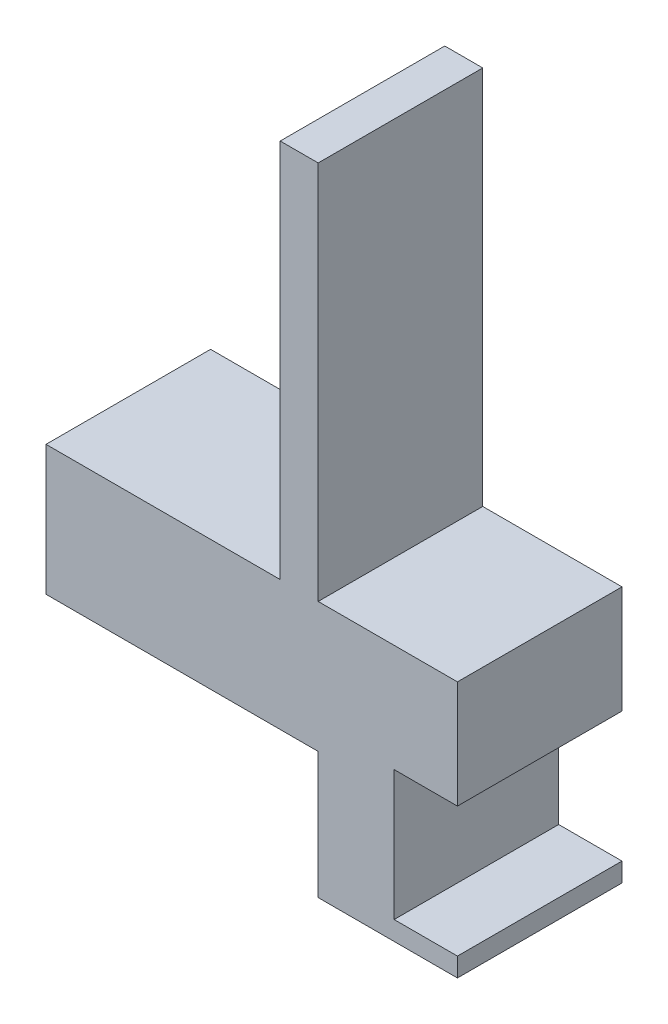
ISO-10303-21;
HEADER;
FILE_DESCRIPTION(('STEP AP214'),'2;1');
FILE_NAME('part.step','',(''),(''),'','','');
FILE_SCHEMA(('AUTOMOTIVE_DESIGN { 1 0 10303 214 1 1 1 1 }'));
ENDSEC;
DATA;
#1=APPLICATION_CONTEXT('core data for automotive mechanical design processes');
#2=APPLICATION_PROTOCOL_DEFINITION('international standard','automotive_design',2000,#1);
#3=PRODUCT_CONTEXT('',#1,'mechanical');
#4=PRODUCT('Part','Part','',(#3));
#5=PRODUCT_RELATED_PRODUCT_CATEGORY('part','',(#4));
#6=PRODUCT_DEFINITION_FORMATION('','',#4);
#7=PRODUCT_DEFINITION_CONTEXT('part definition',#1,'design');
#8=PRODUCT_DEFINITION('design','',#6,#7);
#9=PRODUCT_DEFINITION_SHAPE('','',#8);
#10=(LENGTH_UNIT() NAMED_UNIT(*) SI_UNIT(.MILLI.,.METRE.));
#11=(NAMED_UNIT(*) PLANE_ANGLE_UNIT() SI_UNIT($,.RADIAN.));
#12=(NAMED_UNIT(*) SI_UNIT($,.STERADIAN.) SOLID_ANGLE_UNIT());
#13=UNCERTAINTY_MEASURE_WITH_UNIT(LENGTH_MEASURE(1.E-05),#10,'distance_accuracy_value','');
#14=(GEOMETRIC_REPRESENTATION_CONTEXT(3) GLOBAL_UNCERTAINTY_ASSIGNED_CONTEXT((#13)) GLOBAL_UNIT_ASSIGNED_CONTEXT((#10,
#11,#12)) REPRESENTATION_CONTEXT('',''));
#15=CARTESIAN_POINT('',(0.,0.,0.));
#16=DIRECTION('',(0.,0.,1.));
#17=DIRECTION('',(1.,0.,0.));
#18=AXIS2_PLACEMENT_3D('',#15,#16,#17);
#19=CARTESIAN_POINT('',(0.,20.52,26.));
#20=DIRECTION('',(0.,-1.,0.));
#21=DIRECTION('',(0.,0.,-1.));
#22=AXIS2_PLACEMENT_3D('',#19,#20,#21);
#23=PLANE('',#22);
#24=DIRECTION('',(0.,0.,1.));
#25=VECTOR('',#24,1.);
#26=CARTESIAN_POINT('',(37.,20.52,0.));
#27=LINE('',#26,#25);
#28=CARTESIAN_POINT('',(37.,20.52,0.));
#29=VERTEX_POINT('',#28);
#30=CARTESIAN_POINT('',(37.,20.52,26.));
#31=VERTEX_POINT('',#30);
#32=EDGE_CURVE('E193',#29,#31,#27,.T.);
#33=ORIENTED_EDGE('',*,*,#32,.F.);
#34=DIRECTION('',(-1.,0.,0.));
#35=VECTOR('',#34,1.);
#36=CARTESIAN_POINT('',(0.,20.52,0.));
#37=LINE('',#36,#35);
#38=CARTESIAN_POINT('',(0.,20.52,0.));
#39=VERTEX_POINT('',#38);
#40=EDGE_CURVE('E266',#29,#39,#37,.T.);
#41=ORIENTED_EDGE('',*,*,#40,.T.);
#42=DIRECTION('',(0.,0.,-1.));
#43=VECTOR('',#42,1.);
#44=CARTESIAN_POINT('',(0.,20.52,26.));
#45=LINE('',#44,#43);
#46=CARTESIAN_POINT('',(0.,20.52,26.));
#47=VERTEX_POINT('',#46);
#48=EDGE_CURVE('E246',#47,#39,#45,.T.);
#49=ORIENTED_EDGE('',*,*,#48,.F.);
#50=DIRECTION('',(-1.,0.,0.));
#51=VECTOR('',#50,1.);
#52=CARTESIAN_POINT('',(45.,20.52,26.));
#53=LINE('',#52,#51);
#54=EDGE_CURVE('E56',#31,#47,#53,.T.);
#55=ORIENTED_EDGE('',*,*,#54,.F.);
#56=EDGE_LOOP('',(#33,#41,#49,#55));
#57=FACE_BOUND('',#56,.T.);
#58=ADVANCED_FACE('F33',(#57),#23,.F.);
#59=DIRECTION('',(0.,0.,-1.));
#60=VECTOR('',#59,1.);
#61=CARTESIAN_POINT('',(43.,20.52,0.));
#62=LINE('',#61,#60);
#63=CARTESIAN_POINT('',(43.,20.52,26.));
#64=VERTEX_POINT('',#63);
#65=CARTESIAN_POINT('',(43.,20.52,0.));
#66=VERTEX_POINT('',#65);
#67=EDGE_CURVE('E201',#64,#66,#62,.T.);
#68=ORIENTED_EDGE('',*,*,#67,.F.);
#69=CARTESIAN_POINT('',(65.,20.52,26.));
#70=VERTEX_POINT('',#69);
#71=EDGE_CURVE('E243',#70,#64,#53,.T.);
#72=ORIENTED_EDGE('',*,*,#71,.F.);
#73=DIRECTION('',(0.,0.,-1.));
#74=VECTOR('',#73,1.);
#75=CARTESIAN_POINT('',(65.,20.52,26.));
#76=LINE('',#75,#74);
#77=CARTESIAN_POINT('',(65.,20.52,0.));
#78=VERTEX_POINT('',#77);
#79=EDGE_CURVE('E270',#70,#78,#76,.T.);
#80=ORIENTED_EDGE('',*,*,#79,.T.);
#81=EDGE_CURVE('E227',#78,#66,#37,.T.);
#82=ORIENTED_EDGE('',*,*,#81,.T.);
#83=EDGE_LOOP('',(#68,#72,#80,#82));
#84=FACE_BOUND('',#83,.T.);
#85=ADVANCED_FACE('F337',(#84),#23,.F.);
#86=CARTESIAN_POINT('',(0.,0.,26.));
#87=DIRECTION('',(1.,0.,0.));
#88=DIRECTION('',(0.,0.,-1.));
#89=AXIS2_PLACEMENT_3D('',#86,#87,#88);
#90=PLANE('',#89);
#91=DIRECTION('',(0.,-1.,0.));
#92=VECTOR('',#91,1.);
#93=CARTESIAN_POINT('',(0.,0.,0.));
#94=LINE('',#93,#92);
#95=CARTESIAN_POINT('',(0.,0.,0.));
#96=VERTEX_POINT('',#95);
#97=EDGE_CURVE('E222',#39,#96,#94,.T.);
#98=ORIENTED_EDGE('',*,*,#97,.T.);
#99=DIRECTION('',(0.,0.,-1.));
#100=VECTOR('',#99,1.);
#101=CARTESIAN_POINT('',(0.,0.,26.));
#102=LINE('',#101,#100);
#103=CARTESIAN_POINT('',(0.,0.,26.));
#104=VERTEX_POINT('',#103);
#105=EDGE_CURVE('E11',#104,#96,#102,.T.);
#106=ORIENTED_EDGE('',*,*,#105,.F.);
#107=DIRECTION('',(0.,-1.,0.));
#108=VECTOR('',#107,1.);
#109=CARTESIAN_POINT('',(0.,0.,26.));
#110=LINE('',#109,#108);
#111=EDGE_CURVE('E223',#47,#104,#110,.T.);
#112=ORIENTED_EDGE('',*,*,#111,.F.);
#113=ORIENTED_EDGE('',*,*,#48,.T.);
#114=EDGE_LOOP('',(#98,#106,#112,#113));
#115=FACE_BOUND('',#114,.T.);
#116=ADVANCED_FACE('F35',(#115),#90,.F.);
#117=CARTESIAN_POINT('',(0.,0.,26.));
#118=DIRECTION('',(0.,1.,0.));
#119=DIRECTION('',(0.,0.,1.));
#120=AXIS2_PLACEMENT_3D('',#117,#118,#119);
#121=PLANE('',#120);
#122=DIRECTION('',(1.,0.,0.));
#123=VECTOR('',#122,1.);
#124=CARTESIAN_POINT('',(0.,0.,0.));
#125=LINE('',#124,#123);
#126=CARTESIAN_POINT('',(43.,0.,0.));
#127=VERTEX_POINT('',#126);
#128=EDGE_CURVE('E249',#96,#127,#125,.T.);
#129=ORIENTED_EDGE('',*,*,#128,.T.);
#130=DIRECTION('',(0.,0.,-1.));
#131=VECTOR('',#130,1.);
#132=CARTESIAN_POINT('',(43.,0.,26.));
#133=LINE('',#132,#131);
#134=CARTESIAN_POINT('',(43.,0.,26.));
#135=VERTEX_POINT('',#134);
#136=EDGE_CURVE('E41',#135,#127,#133,.T.);
#137=ORIENTED_EDGE('',*,*,#136,.F.);
#138=DIRECTION('',(1.,0.,0.));
#139=VECTOR('',#138,1.);
#140=CARTESIAN_POINT('',(0.,0.,26.));
#141=LINE('',#140,#139);
#142=EDGE_CURVE('E226',#104,#135,#141,.T.);
#143=ORIENTED_EDGE('',*,*,#142,.F.);
#144=ORIENTED_EDGE('',*,*,#105,.T.);
#145=EDGE_LOOP('',(#129,#137,#143,#144));
#146=FACE_BOUND('',#145,.T.);
#147=ADVANCED_FACE('F318',(#146),#121,.F.);
#148=CARTESIAN_POINT('',(43.,-20.,26.));
#149=DIRECTION('',(1.,0.,0.));
#150=DIRECTION('',(0.,0.,-1.));
#151=AXIS2_PLACEMENT_3D('',#148,#149,#150);
#152=PLANE('',#151);
#153=DIRECTION('',(0.,-1.,0.));
#154=VECTOR('',#153,1.);
#155=CARTESIAN_POINT('',(43.,-20.,0.));
#156=LINE('',#155,#154);
#157=CARTESIAN_POINT('',(43.,-20.,0.));
#158=VERTEX_POINT('',#157);
#159=EDGE_CURVE('E251',#127,#158,#156,.T.);
#160=ORIENTED_EDGE('',*,*,#159,.T.);
#161=DIRECTION('',(0.,0.,-1.));
#162=VECTOR('',#161,1.);
#163=CARTESIAN_POINT('',(43.,-20.,26.));
#164=LINE('',#163,#162);
#165=CARTESIAN_POINT('',(43.,-20.,26.));
#166=VERTEX_POINT('',#165);
#167=EDGE_CURVE('E288',#166,#158,#164,.T.);
#168=ORIENTED_EDGE('',*,*,#167,.F.);
#169=DIRECTION('',(0.,-1.,0.));
#170=VECTOR('',#169,1.);
#171=CARTESIAN_POINT('',(43.,-20.,26.));
#172=LINE('',#171,#170);
#173=EDGE_CURVE('E229',#135,#166,#172,.T.);
#174=ORIENTED_EDGE('',*,*,#173,.F.);
#175=ORIENTED_EDGE('',*,*,#136,.T.);
#176=EDGE_LOOP('',(#160,#168,#174,#175));
#177=FACE_BOUND('',#176,.T.);
#178=ADVANCED_FACE('F295',(#177),#152,.F.);
#179=CARTESIAN_POINT('',(65.,-20.,26.));
#180=DIRECTION('',(0.,1.,0.));
#181=DIRECTION('',(0.,0.,1.));
#182=AXIS2_PLACEMENT_3D('',#179,#180,#181);
#183=PLANE('',#182);
#184=DIRECTION('',(1.,0.,0.));
#185=VECTOR('',#184,1.);
#186=CARTESIAN_POINT('',(65.,-20.,0.));
#187=LINE('',#186,#185);
#188=CARTESIAN_POINT('',(65.,-20.,0.));
#189=VERTEX_POINT('',#188);
#190=EDGE_CURVE('E253',#158,#189,#187,.T.);
#191=ORIENTED_EDGE('',*,*,#190,.T.);
#192=DIRECTION('',(0.,0.,-1.));
#193=VECTOR('',#192,1.);
#194=CARTESIAN_POINT('',(65.,-20.,26.));
#195=LINE('',#194,#193);
#196=CARTESIAN_POINT('',(65.,-20.,26.));
#197=VERTEX_POINT('',#196);
#198=EDGE_CURVE('E285',#197,#189,#195,.T.);
#199=ORIENTED_EDGE('',*,*,#198,.F.);
#200=DIRECTION('',(1.,0.,0.));
#201=VECTOR('',#200,1.);
#202=CARTESIAN_POINT('',(65.,-20.,26.));
#203=LINE('',#202,#201);
#204=EDGE_CURVE('E231',#166,#197,#203,.T.);
#205=ORIENTED_EDGE('',*,*,#204,.F.);
#206=ORIENTED_EDGE('',*,*,#167,.T.);
#207=EDGE_LOOP('',(#191,#199,#205,#206));
#208=FACE_BOUND('',#207,.T.);
#209=ADVANCED_FACE('F306',(#208),#183,.F.);
#210=CARTESIAN_POINT('',(65.,-17.,26.));
#211=DIRECTION('',(-1.,0.,0.));
#212=DIRECTION('',(0.,0.,1.));
#213=AXIS2_PLACEMENT_3D('',#210,#211,#212);
#214=PLANE('',#213);
#215=DIRECTION('',(0.,1.,0.));
#216=VECTOR('',#215,1.);
#217=CARTESIAN_POINT('',(65.,-17.,0.));
#218=LINE('',#217,#216);
#219=CARTESIAN_POINT('',(65.,-17.,0.));
#220=VERTEX_POINT('',#219);
#221=EDGE_CURVE('E255',#189,#220,#218,.T.);
#222=ORIENTED_EDGE('',*,*,#221,.T.);
#223=DIRECTION('',(0.,0.,-1.));
#224=VECTOR('',#223,1.);
#225=CARTESIAN_POINT('',(65.,-17.,26.));
#226=LINE('',#225,#224);
#227=CARTESIAN_POINT('',(65.,-17.,26.));
#228=VERTEX_POINT('',#227);
#229=EDGE_CURVE('E282',#228,#220,#226,.T.);
#230=ORIENTED_EDGE('',*,*,#229,.F.);
#231=DIRECTION('',(0.,1.,0.));
#232=VECTOR('',#231,1.);
#233=CARTESIAN_POINT('',(65.,-17.,26.));
#234=LINE('',#233,#232);
#235=EDGE_CURVE('E233',#197,#228,#234,.T.);
#236=ORIENTED_EDGE('',*,*,#235,.F.);
#237=ORIENTED_EDGE('',*,*,#198,.T.);
#238=EDGE_LOOP('',(#222,#230,#236,#237));
#239=FACE_BOUND('',#238,.T.);
#240=ADVANCED_FACE('F310',(#239),#214,.F.);
#241=CARTESIAN_POINT('',(55.,-17.,26.));
#242=DIRECTION('',(0.,-1.,0.));
#243=DIRECTION('',(0.,0.,-1.));
#244=AXIS2_PLACEMENT_3D('',#241,#242,#243);
#245=PLANE('',#244);
#246=DIRECTION('',(-1.,0.,0.));
#247=VECTOR('',#246,1.);
#248=CARTESIAN_POINT('',(55.,-17.,0.));
#249=LINE('',#248,#247);
#250=CARTESIAN_POINT('',(55.,-17.,0.));
#251=VERTEX_POINT('',#250);
#252=EDGE_CURVE('E257',#220,#251,#249,.T.);
#253=ORIENTED_EDGE('',*,*,#252,.T.);
#254=DIRECTION('',(0.,0.,-1.));
#255=VECTOR('',#254,1.);
#256=CARTESIAN_POINT('',(55.,-17.,26.));
#257=LINE('',#256,#255);
#258=CARTESIAN_POINT('',(55.,-17.,26.));
#259=VERTEX_POINT('',#258);
#260=EDGE_CURVE('E279',#259,#251,#257,.T.);
#261=ORIENTED_EDGE('',*,*,#260,.F.);
#262=DIRECTION('',(-1.,0.,0.));
#263=VECTOR('',#262,1.);
#264=CARTESIAN_POINT('',(55.,-17.,26.));
#265=LINE('',#264,#263);
#266=EDGE_CURVE('E235',#228,#259,#265,.T.);
#267=ORIENTED_EDGE('',*,*,#266,.F.);
#268=ORIENTED_EDGE('',*,*,#229,.T.);
#269=EDGE_LOOP('',(#253,#261,#267,#268));
#270=FACE_BOUND('',#269,.T.);
#271=ADVANCED_FACE('F353',(#270),#245,.F.);
#272=CARTESIAN_POINT('',(55.,3.52,26.));
#273=DIRECTION('',(-1.,0.,0.));
#274=DIRECTION('',(0.,0.,1.));
#275=AXIS2_PLACEMENT_3D('',#272,#273,#274);
#276=PLANE('',#275);
#277=DIRECTION('',(0.,1.,0.));
#278=VECTOR('',#277,1.);
#279=CARTESIAN_POINT('',(55.,3.52,0.));
#280=LINE('',#279,#278);
#281=CARTESIAN_POINT('',(55.,3.52,0.));
#282=VERTEX_POINT('',#281);
#283=EDGE_CURVE('E259',#251,#282,#280,.T.);
#284=ORIENTED_EDGE('',*,*,#283,.T.);
#285=DIRECTION('',(0.,0.,-1.));
#286=VECTOR('',#285,1.);
#287=CARTESIAN_POINT('',(55.,3.52,26.));
#288=LINE('',#287,#286);
#289=CARTESIAN_POINT('',(55.,3.52,26.));
#290=VERTEX_POINT('',#289);
#291=EDGE_CURVE('E276',#290,#282,#288,.T.);
#292=ORIENTED_EDGE('',*,*,#291,.F.);
#293=DIRECTION('',(0.,1.,0.));
#294=VECTOR('',#293,1.);
#295=CARTESIAN_POINT('',(55.,3.52,26.));
#296=LINE('',#295,#294);
#297=EDGE_CURVE('E237',#259,#290,#296,.T.);
#298=ORIENTED_EDGE('',*,*,#297,.F.);
#299=ORIENTED_EDGE('',*,*,#260,.T.);
#300=EDGE_LOOP('',(#284,#292,#298,#299));
#301=FACE_BOUND('',#300,.T.);
#302=ADVANCED_FACE('F351',(#301),#276,.F.);
#303=CARTESIAN_POINT('',(65.,3.52,26.));
#304=DIRECTION('',(0.,1.,0.));
#305=DIRECTION('',(-1.,0.,0.));
#306=AXIS2_PLACEMENT_3D('',#303,#304,#305);
#307=PLANE('',#306);
#308=DIRECTION('',(1.,0.,0.));
#309=VECTOR('',#308,1.);
#310=CARTESIAN_POINT('',(65.,3.52,0.));
#311=LINE('',#310,#309);
#312=CARTESIAN_POINT('',(65.,3.52,0.));
#313=VERTEX_POINT('',#312);
#314=EDGE_CURVE('E261',#282,#313,#311,.T.);
#315=ORIENTED_EDGE('',*,*,#314,.T.);
#316=DIRECTION('',(0.,0.,-1.));
#317=VECTOR('',#316,1.);
#318=CARTESIAN_POINT('',(65.,3.52,26.));
#319=LINE('',#318,#317);
#320=CARTESIAN_POINT('',(65.,3.52,26.));
#321=VERTEX_POINT('',#320);
#322=EDGE_CURVE('E273',#321,#313,#319,.T.);
#323=ORIENTED_EDGE('',*,*,#322,.F.);
#324=DIRECTION('',(1.,0.,0.));
#325=VECTOR('',#324,1.);
#326=CARTESIAN_POINT('',(65.,3.52,26.));
#327=LINE('',#326,#325);
#328=EDGE_CURVE('E239',#290,#321,#327,.T.);
#329=ORIENTED_EDGE('',*,*,#328,.F.);
#330=ORIENTED_EDGE('',*,*,#291,.T.);
#331=EDGE_LOOP('',(#315,#323,#329,#330));
#332=FACE_BOUND('',#331,.T.);
#333=ADVANCED_FACE('F347',(#332),#307,.F.);
#334=CARTESIAN_POINT('',(65.,20.52,26.));
#335=DIRECTION('',(-1.,0.,0.));
#336=DIRECTION('',(0.,0.,1.));
#337=AXIS2_PLACEMENT_3D('',#334,#335,#336);
#338=PLANE('',#337);
#339=DIRECTION('',(0.,1.,0.));
#340=VECTOR('',#339,1.);
#341=CARTESIAN_POINT('',(65.,20.52,0.));
#342=LINE('',#341,#340);
#343=EDGE_CURVE('E263',#313,#78,#342,.T.);
#344=ORIENTED_EDGE('',*,*,#343,.T.);
#345=ORIENTED_EDGE('',*,*,#79,.F.);
#346=DIRECTION('',(0.,1.,0.));
#347=VECTOR('',#346,1.);
#348=CARTESIAN_POINT('',(65.,20.52,26.));
#349=LINE('',#348,#347);
#350=EDGE_CURVE('E241',#321,#70,#349,.T.);
#351=ORIENTED_EDGE('',*,*,#350,.F.);
#352=ORIENTED_EDGE('',*,*,#322,.T.);
#353=EDGE_LOOP('',(#344,#345,#351,#352));
#354=FACE_BOUND('',#353,.T.);
#355=ADVANCED_FACE('F343',(#354),#338,.F.);
#356=CARTESIAN_POINT('',(0.,0.,26.));
#357=DIRECTION('',(0.,0.,-1.));
#358=DIRECTION('',(-1.,0.,0.));
#359=AXIS2_PLACEMENT_3D('',#356,#357,#358);
#360=PLANE('',#359);
#361=ORIENTED_EDGE('',*,*,#111,.T.);
#362=ORIENTED_EDGE('',*,*,#142,.T.);
#363=ORIENTED_EDGE('',*,*,#173,.T.);
#364=ORIENTED_EDGE('',*,*,#204,.T.);
#365=ORIENTED_EDGE('',*,*,#235,.T.);
#366=ORIENTED_EDGE('',*,*,#266,.T.);
#367=ORIENTED_EDGE('',*,*,#297,.T.);
#368=ORIENTED_EDGE('',*,*,#328,.T.);
#369=ORIENTED_EDGE('',*,*,#350,.T.);
#370=ORIENTED_EDGE('',*,*,#71,.T.);
#371=DIRECTION('',(0.,-1.,0.));
#372=VECTOR('',#371,1.);
#373=CARTESIAN_POINT('',(43.,80.52,26.));
#374=LINE('',#373,#372);
#375=CARTESIAN_POINT('',(43.,80.52,26.));
#376=VERTEX_POINT('',#375);
#377=EDGE_CURVE('E217',#376,#64,#374,.T.);
#378=ORIENTED_EDGE('',*,*,#377,.F.);
#379=DIRECTION('',(1.,0.,0.));
#380=VECTOR('',#379,1.);
#381=CARTESIAN_POINT('',(37.,80.52,26.));
#382=LINE('',#381,#380);
#383=CARTESIAN_POINT('',(37.,80.52,26.));
#384=VERTEX_POINT('',#383);
#385=EDGE_CURVE('E200',#384,#376,#382,.T.);
#386=ORIENTED_EDGE('',*,*,#385,.F.);
#387=DIRECTION('',(0.,-1.,0.));
#388=VECTOR('',#387,1.);
#389=CARTESIAN_POINT('',(37.,80.52,26.));
#390=LINE('',#389,#388);
#391=EDGE_CURVE('E220',#384,#31,#390,.T.);
#392=ORIENTED_EDGE('',*,*,#391,.T.);
#393=ORIENTED_EDGE('',*,*,#54,.T.);
#394=EDGE_LOOP('',(#361,#362,#363,#364,#365,#366,#367,#368,#369,#370,#378,#386,#392,#393));
#395=FACE_BOUND('',#394,.T.);
#396=ADVANCED_FACE('F314',(#395),#360,.F.);
#397=CARTESIAN_POINT('',(0.,0.,0.));
#398=DIRECTION('',(0.,0.,-1.));
#399=DIRECTION('',(-1.,0.,0.));
#400=AXIS2_PLACEMENT_3D('',#397,#398,#399);
#401=PLANE('',#400);
#402=ORIENTED_EDGE('',*,*,#97,.F.);
#403=ORIENTED_EDGE('',*,*,#40,.F.);
#404=DIRECTION('',(0.,-1.,0.));
#405=VECTOR('',#404,1.);
#406=CARTESIAN_POINT('',(37.,80.52,0.));
#407=LINE('',#406,#405);
#408=CARTESIAN_POINT('',(37.,80.52,0.));
#409=VERTEX_POINT('',#408);
#410=EDGE_CURVE('E207',#409,#29,#407,.T.);
#411=ORIENTED_EDGE('',*,*,#410,.F.);
#412=DIRECTION('',(-1.,0.,0.));
#413=VECTOR('',#412,1.);
#414=CARTESIAN_POINT('',(37.,80.52,0.));
#415=LINE('',#414,#413);
#416=CARTESIAN_POINT('',(43.,80.52,0.));
#417=VERTEX_POINT('',#416);
#418=EDGE_CURVE('E205',#417,#409,#415,.T.);
#419=ORIENTED_EDGE('',*,*,#418,.F.);
#420=DIRECTION('',(0.,-1.,0.));
#421=VECTOR('',#420,1.);
#422=CARTESIAN_POINT('',(43.,80.52,0.));
#423=LINE('',#422,#421);
#424=EDGE_CURVE('E214',#417,#66,#423,.T.);
#425=ORIENTED_EDGE('',*,*,#424,.T.);
#426=ORIENTED_EDGE('',*,*,#81,.F.);
#427=ORIENTED_EDGE('',*,*,#343,.F.);
#428=ORIENTED_EDGE('',*,*,#314,.F.);
#429=ORIENTED_EDGE('',*,*,#283,.F.);
#430=ORIENTED_EDGE('',*,*,#252,.F.);
#431=ORIENTED_EDGE('',*,*,#221,.F.);
#432=ORIENTED_EDGE('',*,*,#190,.F.);
#433=ORIENTED_EDGE('',*,*,#159,.F.);
#434=ORIENTED_EDGE('',*,*,#128,.F.);
#435=EDGE_LOOP('',(#402,#403,#411,#419,#425,#426,#427,#428,#429,#430,#431,#432,#433,#434));
#436=FACE_BOUND('',#435,.T.);
#437=ADVANCED_FACE('F301',(#436),#401,.T.);
#438=CARTESIAN_POINT('',(37.,80.52,0.));
#439=DIRECTION('',(1.,0.,0.));
#440=DIRECTION('',(0.,0.,-1.));
#441=AXIS2_PLACEMENT_3D('',#438,#439,#440);
#442=PLANE('',#441);
#443=DIRECTION('',(0.,0.,1.));
#444=VECTOR('',#443,1.);
#445=CARTESIAN_POINT('',(37.,65.27,5.1));
#446=LINE('',#445,#444);
#447=CARTESIAN_POINT('',(37.,65.27,5.1));
#448=VERTEX_POINT('',#447);
#449=CARTESIAN_POINT('',(37.,65.27,20.9));
#450=VERTEX_POINT('',#449);
#451=EDGE_CURVE('E187',#448,#450,#446,.T.);
#452=ORIENTED_EDGE('',*,*,#451,.F.);
#453=DIRECTION('',(0.,-1.,0.));
#454=VECTOR('',#453,1.);
#455=CARTESIAN_POINT('',(37.,75.77,5.1));
#456=LINE('',#455,#454);
#457=CARTESIAN_POINT('',(37.,75.77,5.1));
#458=VERTEX_POINT('',#457);
#459=EDGE_CURVE('E48',#458,#448,#456,.T.);
#460=ORIENTED_EDGE('',*,*,#459,.F.);
#461=DIRECTION('',(0.,0.,-1.));
#462=VECTOR('',#461,1.);
#463=CARTESIAN_POINT('',(37.,75.77,5.1));
#464=LINE('',#463,#462);
#465=CARTESIAN_POINT('',(37.,75.77,20.9));
#466=VERTEX_POINT('',#465);
#467=EDGE_CURVE('E178',#466,#458,#464,.T.);
#468=ORIENTED_EDGE('',*,*,#467,.F.);
#469=DIRECTION('',(0.,1.,0.));
#470=VECTOR('',#469,1.);
#471=CARTESIAN_POINT('',(37.,75.77,20.9));
#472=LINE('',#471,#470);
#473=EDGE_CURVE('E181',#450,#466,#472,.T.);
#474=ORIENTED_EDGE('',*,*,#473,.F.);
#475=EDGE_LOOP('',(#452,#460,#468,#474));
#476=FACE_BOUND('',#475,.T.);
#477=ORIENTED_EDGE('',*,*,#32,.T.);
#478=ORIENTED_EDGE('',*,*,#391,.F.);
#479=DIRECTION('',(0.,0.,1.));
#480=VECTOR('',#479,1.);
#481=CARTESIAN_POINT('',(37.,80.52,0.));
#482=LINE('',#481,#480);
#483=EDGE_CURVE('E197',#409,#384,#482,.T.);
#484=ORIENTED_EDGE('',*,*,#483,.F.);
#485=ORIENTED_EDGE('',*,*,#410,.T.);
#486=EDGE_LOOP('',(#477,#478,#484,#485));
#487=FACE_BOUND('',#486,.T.);
#488=ADVANCED_FACE('F325',(#476,#487),#442,.F.);
#489=CARTESIAN_POINT('',(43.,80.52,0.));
#490=DIRECTION('',(-1.,0.,0.));
#491=DIRECTION('',(0.,0.,1.));
#492=AXIS2_PLACEMENT_3D('',#489,#490,#491);
#493=PLANE('',#492);
#494=ORIENTED_EDGE('',*,*,#67,.T.);
#495=ORIENTED_EDGE('',*,*,#424,.F.);
#496=DIRECTION('',(0.,0.,-1.));
#497=VECTOR('',#496,1.);
#498=CARTESIAN_POINT('',(43.,80.52,0.));
#499=LINE('',#498,#497);
#500=EDGE_CURVE('E203',#376,#417,#499,.T.);
#501=ORIENTED_EDGE('',*,*,#500,.F.);
#502=ORIENTED_EDGE('',*,*,#377,.T.);
#503=EDGE_LOOP('',(#494,#495,#501,#502));
#504=FACE_BOUND('',#503,.T.);
#505=ADVANCED_FACE('F334',(#504),#493,.F.);
#506=CARTESIAN_POINT('',(0.,80.52,0.));
#507=DIRECTION('',(0.,1.,0.));
#508=DIRECTION('',(0.,0.,1.));
#509=AXIS2_PLACEMENT_3D('',#506,#507,#508);
#510=PLANE('',#509);
#511=ORIENTED_EDGE('',*,*,#483,.T.);
#512=ORIENTED_EDGE('',*,*,#385,.T.);
#513=ORIENTED_EDGE('',*,*,#500,.T.);
#514=ORIENTED_EDGE('',*,*,#418,.T.);
#515=EDGE_LOOP('',(#511,#512,#513,#514));
#516=FACE_BOUND('',#515,.T.);
#517=ADVANCED_FACE('F328',(#516),#510,.T.);
#518=CARTESIAN_POINT('',(40.,75.77,5.1));
#519=DIRECTION('',(0.,0.,-1.));
#520=DIRECTION('',(-1.,0.,0.));
#521=AXIS2_PLACEMENT_3D('',#518,#519,#520);
#522=PLANE('',#521);
#523=ORIENTED_EDGE('',*,*,#459,.T.);
#524=DIRECTION('',(-1.,0.,0.));
#525=VECTOR('',#524,1.);
#526=CARTESIAN_POINT('',(40.,65.27,5.1));
#527=LINE('',#526,#525);
#528=CARTESIAN_POINT('',(40.,65.27,5.1));
#529=VERTEX_POINT('',#528);
#530=EDGE_CURVE('E156',#529,#448,#527,.T.);
#531=ORIENTED_EDGE('',*,*,#530,.F.);
#532=DIRECTION('',(0.,-1.,0.));
#533=VECTOR('',#532,1.);
#534=CARTESIAN_POINT('',(40.,75.77,5.1));
#535=LINE('',#534,#533);
#536=CARTESIAN_POINT('',(40.,75.77,5.1));
#537=VERTEX_POINT('',#536);
#538=EDGE_CURVE('E160',#537,#529,#535,.T.);
#539=ORIENTED_EDGE('',*,*,#538,.F.);
#540=DIRECTION('',(-1.,0.,0.));
#541=VECTOR('',#540,1.);
#542=CARTESIAN_POINT('',(40.,75.77,5.1));
#543=LINE('',#542,#541);
#544=EDGE_CURVE('E191',#537,#458,#543,.T.);
#545=ORIENTED_EDGE('',*,*,#544,.T.);
#546=EDGE_LOOP('',(#523,#531,#539,#545));
#547=FACE_BOUND('',#546,.T.);
#548=ADVANCED_FACE('F158',(#547),#522,.F.);
#549=CARTESIAN_POINT('',(40.,75.77,5.1));
#550=DIRECTION('',(0.,1.,0.));
#551=DIRECTION('',(0.,0.,1.));
#552=AXIS2_PLACEMENT_3D('',#549,#550,#551);
#553=PLANE('',#552);
#554=ORIENTED_EDGE('',*,*,#467,.T.);
#555=ORIENTED_EDGE('',*,*,#544,.F.);
#556=DIRECTION('',(0.,0.,-1.));
#557=VECTOR('',#556,1.);
#558=CARTESIAN_POINT('',(40.,75.77,5.1));
#559=LINE('',#558,#557);
#560=CARTESIAN_POINT('',(40.,75.77,20.9));
#561=VERTEX_POINT('',#560);
#562=EDGE_CURVE('E166',#561,#537,#559,.T.);
#563=ORIENTED_EDGE('',*,*,#562,.F.);
#564=DIRECTION('',(-1.,0.,0.));
#565=VECTOR('',#564,1.);
#566=CARTESIAN_POINT('',(40.,75.77,20.9));
#567=LINE('',#566,#565);
#568=EDGE_CURVE('E194',#561,#466,#567,.T.);
#569=ORIENTED_EDGE('',*,*,#568,.T.);
#570=EDGE_LOOP('',(#554,#555,#563,#569));
#571=FACE_BOUND('',#570,.T.);
#572=ADVANCED_FACE('F428',(#571),#553,.F.);
#573=CARTESIAN_POINT('',(40.,75.77,20.9));
#574=DIRECTION('',(0.,0.,1.));
#575=DIRECTION('',(1.,0.,0.));
#576=AXIS2_PLACEMENT_3D('',#573,#574,#575);
#577=PLANE('',#576);
#578=ORIENTED_EDGE('',*,*,#473,.T.);
#579=ORIENTED_EDGE('',*,*,#568,.F.);
#580=DIRECTION('',(0.,1.,0.));
#581=VECTOR('',#580,1.);
#582=CARTESIAN_POINT('',(40.,75.77,20.9));
#583=LINE('',#582,#581);
#584=CARTESIAN_POINT('',(40.,65.27,20.9));
#585=VERTEX_POINT('',#584);
#586=EDGE_CURVE('E174',#585,#561,#583,.T.);
#587=ORIENTED_EDGE('',*,*,#586,.F.);
#588=DIRECTION('',(-1.,0.,0.));
#589=VECTOR('',#588,1.);
#590=CARTESIAN_POINT('',(40.,65.27,20.9));
#591=LINE('',#590,#589);
#592=EDGE_CURVE('E165',#585,#450,#591,.T.);
#593=ORIENTED_EDGE('',*,*,#592,.T.);
#594=EDGE_LOOP('',(#578,#579,#587,#593));
#595=FACE_BOUND('',#594,.T.);
#596=ADVANCED_FACE('F435',(#595),#577,.F.);
#597=CARTESIAN_POINT('',(40.,65.27,5.1));
#598=DIRECTION('',(0.,-1.,0.));
#599=DIRECTION('',(0.,0.,-1.));
#600=AXIS2_PLACEMENT_3D('',#597,#598,#599);
#601=PLANE('',#600);
#602=ORIENTED_EDGE('',*,*,#451,.T.);
#603=ORIENTED_EDGE('',*,*,#592,.F.);
#604=DIRECTION('',(0.,0.,1.));
#605=VECTOR('',#604,1.);
#606=CARTESIAN_POINT('',(40.,65.27,5.1));
#607=LINE('',#606,#605);
#608=EDGE_CURVE('E169',#529,#585,#607,.T.);
#609=ORIENTED_EDGE('',*,*,#608,.F.);
#610=ORIENTED_EDGE('',*,*,#530,.T.);
#611=EDGE_LOOP('',(#602,#603,#609,#610));
#612=FACE_BOUND('',#611,.T.);
#613=ADVANCED_FACE('F170',(#612),#601,.F.);
#614=CARTESIAN_POINT('',(40.,0.,0.));
#615=DIRECTION('',(-1.,0.,0.));
#616=DIRECTION('',(0.,0.,1.));
#617=AXIS2_PLACEMENT_3D('',#614,#615,#616);
#618=PLANE('',#617);
#619=ORIENTED_EDGE('',*,*,#538,.T.);
#620=ORIENTED_EDGE('',*,*,#608,.T.);
#621=ORIENTED_EDGE('',*,*,#586,.T.);
#622=ORIENTED_EDGE('',*,*,#562,.T.);
#623=EDGE_LOOP('',(#619,#620,#621,#622));
#624=FACE_BOUND('',#623,.T.);
#625=ADVANCED_FACE('F176',(#624),#618,.T.);
#626=CLOSED_SHELL('',(#58,#85,#116,#147,#178,#209,#240,#271,#302,#333,#355,#396,#437,#488,#505,
#517,#548,#572,#596,#613,#625));
#627=MANIFOLD_SOLID_BREP('B2',#626);
#628=ADVANCED_BREP_SHAPE_REPRESENTATION('',(#18,#627),#14);
#629=SHAPE_DEFINITION_REPRESENTATION(#9,#628);
ENDSEC;
END-ISO-10303-21;
